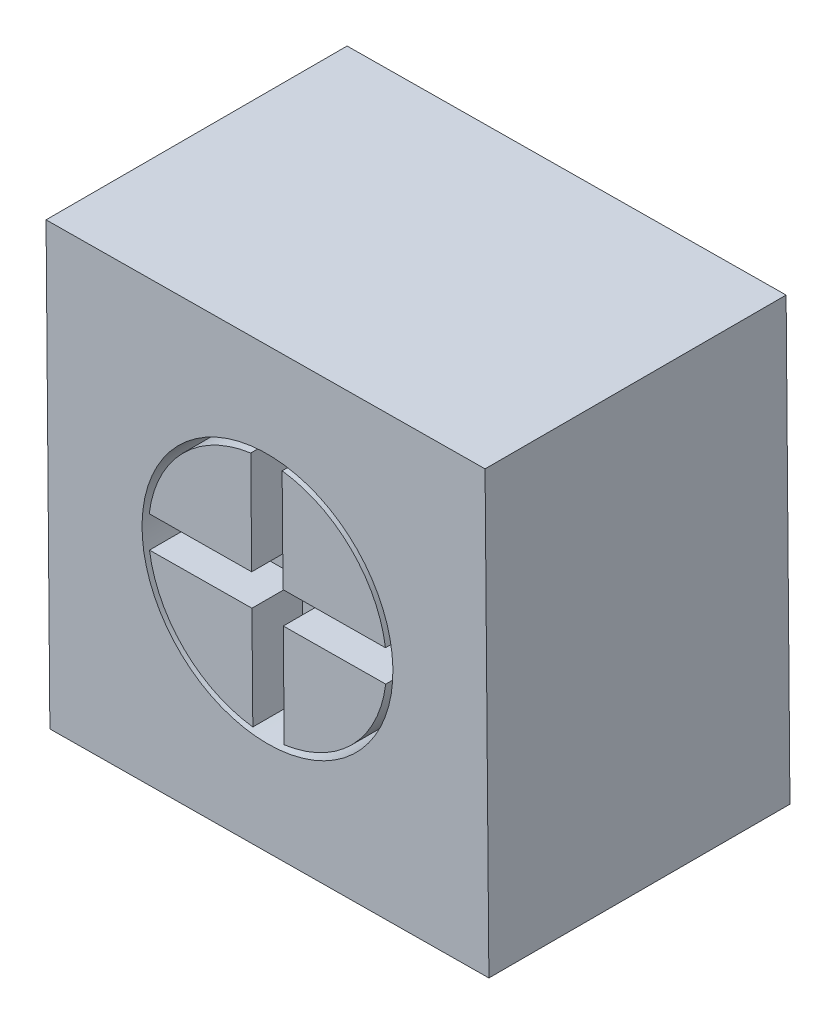
ISO-10303-21;
HEADER;
FILE_DESCRIPTION(('STEP AP214'),'2;1');
FILE_NAME('part.step','',(''),(''),'','','');
FILE_SCHEMA(('AUTOMOTIVE_DESIGN { 1 0 10303 214 1 1 1 1 }'));
ENDSEC;
DATA;
#1=APPLICATION_CONTEXT('core data for automotive mechanical design processes');
#2=APPLICATION_PROTOCOL_DEFINITION('international standard','automotive_design',2000,#1);
#3=PRODUCT_CONTEXT('',#1,'mechanical');
#4=PRODUCT('Part','Part','',(#3));
#5=PRODUCT_RELATED_PRODUCT_CATEGORY('part','',(#4));
#6=PRODUCT_DEFINITION_FORMATION('','',#4);
#7=PRODUCT_DEFINITION_CONTEXT('part definition',#1,'design');
#8=PRODUCT_DEFINITION('design','',#6,#7);
#9=PRODUCT_DEFINITION_SHAPE('','',#8);
#10=(LENGTH_UNIT() NAMED_UNIT(*) SI_UNIT(.MILLI.,.METRE.));
#11=(NAMED_UNIT(*) PLANE_ANGLE_UNIT() SI_UNIT($,.RADIAN.));
#12=(NAMED_UNIT(*) SI_UNIT($,.STERADIAN.) SOLID_ANGLE_UNIT());
#13=UNCERTAINTY_MEASURE_WITH_UNIT(LENGTH_MEASURE(1.E-05),#10,'distance_accuracy_value','');
#14=(GEOMETRIC_REPRESENTATION_CONTEXT(3) GLOBAL_UNCERTAINTY_ASSIGNED_CONTEXT((#13)) GLOBAL_UNIT_ASSIGNED_CONTEXT((#10,
#11,#12)) REPRESENTATION_CONTEXT('',''));
#15=CARTESIAN_POINT('',(0.,0.,0.));
#16=DIRECTION('',(0.,0.,1.));
#17=DIRECTION('',(1.,0.,0.));
#18=AXIS2_PLACEMENT_3D('',#15,#16,#17);
#19=CARTESIAN_POINT('',(11.8204337166092,8.08127161597988,10.5500249999999));
#20=DIRECTION('',(0.00872653549837708,-0.999961923064171,0.));
#21=DIRECTION('',(0.999961923064171,0.00872653549837708,0.));
#22=AXIS2_PLACEMENT_3D('',#19,#20,#21);
#23=PLANE('',#22);
#24=DIRECTION('',(-0.999961923064171,-0.0087265354983762,0.));
#25=VECTOR('',#24,1.);
#26=CARTESIAN_POINT('',(12.6371430277289,8.08839893016151,9.75002499999992));
#27=LINE('',#26,#25);
#28=CARTESIAN_POINT('',(12.6371430277289,8.08839893016151,9.75002499999992));
#29=VERTEX_POINT('',#28);
#30=CARTESIAN_POINT('',(11.0037244054895,8.07414430179826,9.75002499999992));
#31=VERTEX_POINT('',#30);
#32=EDGE_CURVE('P0_E97',#29,#31,#27,.T.);
#33=ORIENTED_EDGE('',*,*,#32,.F.);
#34=DIRECTION('',(0.,0.,1.));
#35=VECTOR('',#34,1.);
#36=CARTESIAN_POINT('',(12.6371430277289,8.08839893016151,10.5500249999999));
#37=LINE('',#36,#35);
#38=CARTESIAN_POINT('',(12.6371430277289,8.08839893016151,10.5500249999999));
#39=VERTEX_POINT('',#38);
#40=EDGE_CURVE('P0_E163',#39,#29,#37,.F.);
#41=ORIENTED_EDGE('',*,*,#40,.F.);
#42=DIRECTION('',(0.999961923064171,0.00872653549838258,0.));
#43=VECTOR('',#42,1.);
#44=CARTESIAN_POINT('',(11.0037244054895,8.07414430179825,10.5500249999999));
#45=LINE('',#44,#43);
#46=CARTESIAN_POINT('',(11.0037244054895,8.07414430179825,10.5500249999999));
#47=VERTEX_POINT('',#46);
#48=EDGE_CURVE('P0_E185',#47,#39,#45,.T.);
#49=ORIENTED_EDGE('',*,*,#48,.F.);
#50=DIRECTION('',(0.,0.,1.));
#51=VECTOR('',#50,1.);
#52=CARTESIAN_POINT('',(11.0037244054895,8.07414430179825,10.5500249999999));
#53=LINE('',#52,#51);
#54=EDGE_CURVE('P0_E166',#47,#31,#53,.F.);
#55=ORIENTED_EDGE('',*,*,#54,.T.);
#56=EDGE_LOOP('',(#33,#41,#49,#55));
#57=FACE_BOUND('',#56,.T.);
#58=ADVANCED_FACE('P0_F17',(#57),#23,.T.);
#59=CARTESIAN_POINT('',(12.6300157135473,8.90510824128119,10.5500249999999));
#60=DIRECTION('',(0.999961923064171,0.00872653549837334,0.));
#61=DIRECTION('',(-0.00872653549837334,0.999961923064171,0.));
#62=AXIS2_PLACEMENT_3D('',#59,#60,#61);
#63=PLANE('',#62);
#64=DIRECTION('',(0.00872653549834558,-0.999961923064172,0.));
#65=VECTOR('',#64,1.);
#66=CARTESIAN_POINT('',(12.6228883993657,9.72181755240088,9.75002499999993));
#67=LINE('',#66,#65);
#68=CARTESIAN_POINT('',(12.6228883993657,9.72181755240088,9.75002499999993));
#69=VERTEX_POINT('',#68);
#70=EDGE_CURVE('P0_E135',#69,#29,#67,.T.);
#71=ORIENTED_EDGE('',*,*,#70,.F.);
#72=DIRECTION('',(0.,0.,1.));
#73=VECTOR('',#72,1.);
#74=CARTESIAN_POINT('',(12.6228883993657,9.72181755240088,10.5500249999999));
#75=LINE('',#74,#73);
#76=CARTESIAN_POINT('',(12.6228883993657,9.72181755240088,10.5500249999999));
#77=VERTEX_POINT('',#76);
#78=EDGE_CURVE('P0_E161',#69,#77,#75,.T.);
#79=ORIENTED_EDGE('',*,*,#78,.T.);
#80=DIRECTION('',(-0.00872653549834558,0.999961923064172,0.));
#81=VECTOR('',#80,1.);
#82=CARTESIAN_POINT('',(12.6371430277289,8.08839893016151,10.5500249999999));
#83=LINE('',#82,#81);
#84=EDGE_CURVE('P0_E217',#39,#77,#83,.T.);
#85=ORIENTED_EDGE('',*,*,#84,.F.);
#86=ORIENTED_EDGE('',*,*,#40,.T.);
#87=EDGE_LOOP('',(#71,#79,#85,#86));
#88=FACE_BOUND('',#87,.T.);
#89=ADVANCED_FACE('P0_F233',(#88),#63,.T.);
#90=CARTESIAN_POINT('',(13.9538333003807,8.09988951209232,10.5500249999999));
#91=DIRECTION('',(0.00872653549837708,-0.999961923064171,0.));
#92=DIRECTION('',(0.999961923064171,0.00872653549837708,0.));
#93=AXIS2_PLACEMENT_3D('',#90,#91,#92);
#94=PLANE('',#93);
#95=DIRECTION('',(-0.999961923064171,-0.0087265354983762,0.));
#96=VECTOR('',#95,1.);
#97=CARTESIAN_POINT('',(14.7705426115004,8.10701682627395,9.75002499999992));
#98=LINE('',#97,#96);
#99=CARTESIAN_POINT('',(14.7705426115004,8.10701682627395,9.75002499999992));
#100=VERTEX_POINT('',#99);
#101=CARTESIAN_POINT('',(13.137123989261,8.0927621979107,9.75002499999993));
#102=VERTEX_POINT('',#101);
#103=EDGE_CURVE('P0_E126',#100,#102,#98,.T.);
#104=ORIENTED_EDGE('',*,*,#103,.F.);
#105=DIRECTION('',(0.,0.,1.));
#106=VECTOR('',#105,1.);
#107=CARTESIAN_POINT('',(14.7705426115004,8.10701682627395,10.5500249999999));
#108=LINE('',#107,#106);
#109=CARTESIAN_POINT('',(14.7705426115004,8.10701682627395,10.5500249999999));
#110=VERTEX_POINT('',#109);
#111=EDGE_CURVE('P0_E155',#100,#110,#108,.T.);
#112=ORIENTED_EDGE('',*,*,#111,.T.);
#113=DIRECTION('',(0.999961923064171,0.00872653549838258,0.));
#114=VECTOR('',#113,1.);
#115=CARTESIAN_POINT('',(13.137123989261,8.09276219791069,10.5500249999999));
#116=LINE('',#115,#114);
#117=CARTESIAN_POINT('',(13.137123989261,8.09276219791069,10.5500249999999));
#118=VERTEX_POINT('',#117);
#119=EDGE_CURVE('P0_E212',#118,#110,#116,.T.);
#120=ORIENTED_EDGE('',*,*,#119,.F.);
#121=DIRECTION('',(0.,0.,1.));
#122=VECTOR('',#121,1.);
#123=CARTESIAN_POINT('',(13.137123989261,8.0927621979107,10.5500249999999));
#124=LINE('',#123,#122);
#125=EDGE_CURVE('P0_E139',#102,#118,#124,.T.);
#126=ORIENTED_EDGE('',*,*,#125,.F.);
#127=EDGE_LOOP('',(#104,#112,#120,#126));
#128=FACE_BOUND('',#127,.T.);
#129=ADVANCED_FACE('P0_F276',(#128),#94,.T.);
#130=CARTESIAN_POINT('',(13.1299966750794,8.90947150903038,10.5500249999999));
#131=DIRECTION('',(-0.999961923064171,-0.00872653549837334,0.));
#132=DIRECTION('',(0.00872653549837334,-0.999961923064171,0.));
#133=AXIS2_PLACEMENT_3D('',#130,#131,#132);
#134=PLANE('',#133);
#135=DIRECTION('',(-0.00872653549834557,0.999961923064171,0.));
#136=VECTOR('',#135,1.);
#137=CARTESIAN_POINT('',(13.137123989261,8.0927621979107,9.75002499999992));
#138=LINE('',#137,#136);
#139=CARTESIAN_POINT('',(13.1228693608978,9.72618082015007,9.75002499999993));
#140=VERTEX_POINT('',#139);
#141=EDGE_CURVE('P0_E123',#102,#140,#138,.T.);
#142=ORIENTED_EDGE('',*,*,#141,.F.);
#143=ORIENTED_EDGE('',*,*,#125,.T.);
#144=DIRECTION('',(0.00872653549834551,-0.999961923064172,0.));
#145=VECTOR('',#144,1.);
#146=CARTESIAN_POINT('',(13.1228693608978,9.72618082015007,10.5500249999999));
#147=LINE('',#146,#145);
#148=CARTESIAN_POINT('',(13.1228693608978,9.72618082015007,10.5500249999999));
#149=VERTEX_POINT('',#148);
#150=EDGE_CURVE('P0_E209',#149,#118,#147,.T.);
#151=ORIENTED_EDGE('',*,*,#150,.F.);
#152=DIRECTION('',(0.,0.,1.));
#153=VECTOR('',#152,1.);
#154=CARTESIAN_POINT('',(13.1228693608978,9.72618082015007,10.5500249999999));
#155=LINE('',#154,#153);
#156=EDGE_CURVE('P0_E153',#149,#140,#155,.F.);
#157=ORIENTED_EDGE('',*,*,#156,.T.);
#158=EDGE_LOOP('',(#142,#143,#151,#157));
#159=FACE_BOUND('',#158,.T.);
#160=ADVANCED_FACE('P0_F239',(#159),#134,.T.);
#161=CARTESIAN_POINT('',(16.4197247473385,4.37126622678977,9.75002499999991));
#162=DIRECTION('',(0.,0.,1.));
#163=DIRECTION('',(0.,-1.,0.));
#164=AXIS2_PLACEMENT_3D('',#161,#162,#163);
#165=PLANE('',#164);
#166=ORIENTED_EDGE('',*,*,#141,.T.);
#167=CARTESIAN_POINT('',(12.8893151423696,7.84059008327006,9.75002499999992));
#168=DIRECTION('',(0.,0.,-1.));
#169=DIRECTION('',(0.,1.,0.));
#170=AXIS2_PLACEMENT_3D('',#167,#168,#169);
#171=CIRCLE('',#170,1.9);
#172=EDGE_CURVE('P0_E125',#140,#69,#171,.F.);
#173=ORIENTED_EDGE('',*,*,#172,.T.);
#174=ORIENTED_EDGE('',*,*,#70,.T.);
#175=ORIENTED_EDGE('',*,*,#32,.T.);
#176=CARTESIAN_POINT('',(12.8893151423696,7.84059008327006,9.75002499999992));
#177=DIRECTION('',(0.,0.,-1.));
#178=DIRECTION('',(0.,1.,0.));
#179=AXIS2_PLACEMENT_3D('',#176,#177,#178);
#180=CIRCLE('',#179,1.9);
#181=CARTESIAN_POINT('',(11.0080876732387,7.57416334026618,9.75002499999992));
#182=VERTEX_POINT('',#181);
#183=EDGE_CURVE('P0_E20',#31,#182,#180,.F.);
#184=ORIENTED_EDGE('',*,*,#183,.T.);
#185=DIRECTION('',(-0.999961923064171,-0.00872653549837708,0.));
#186=VECTOR('',#185,1.);
#187=CARTESIAN_POINT('',(11.8247969843584,7.5812906544478,9.75002499999992));
#188=LINE('',#187,#186);
#189=CARTESIAN_POINT('',(12.6415062954781,7.58841796862943,9.75002499999992));
#190=VERTEX_POINT('',#189);
#191=EDGE_CURVE('P0_E93',#190,#182,#188,.T.);
#192=ORIENTED_EDGE('',*,*,#191,.F.);
#193=DIRECTION('',(-0.00872653549837334,0.999961923064171,0.));
#194=VECTOR('',#193,1.);
#195=CARTESIAN_POINT('',(12.6486336096597,6.77170865750974,9.75002499999992));
#196=LINE('',#195,#194);
#197=CARTESIAN_POINT('',(12.6557609238413,5.95499934639006,9.75002499999992));
#198=VERTEX_POINT('',#197);
#199=EDGE_CURVE('P0_E119',#198,#190,#196,.T.);
#200=ORIENTED_EDGE('',*,*,#199,.F.);
#201=CARTESIAN_POINT('',(12.8893151423696,7.84059008327006,9.75002499999993));
#202=DIRECTION('',(0.,0.,-1.));
#203=DIRECTION('',(0.,1.,0.));
#204=AXIS2_PLACEMENT_3D('',#201,#202,#203);
#205=CIRCLE('',#204,1.9);
#206=CARTESIAN_POINT('',(13.1557418853734,5.95936261413924,9.75002499999992));
#207=VERTEX_POINT('',#206);
#208=EDGE_CURVE('P0_E100',#198,#207,#205,.F.);
#209=ORIENTED_EDGE('',*,*,#208,.T.);
#210=DIRECTION('',(0.00872653549837334,-0.999961923064171,0.));
#211=VECTOR('',#210,1.);
#212=CARTESIAN_POINT('',(13.1486145711918,6.77607192525893,9.75002499999992));
#213=LINE('',#212,#211);
#214=CARTESIAN_POINT('',(13.1414872570102,7.59278123637861,9.75002499999992));
#215=VERTEX_POINT('',#214);
#216=EDGE_CURVE('P0_E111',#215,#207,#213,.T.);
#217=ORIENTED_EDGE('',*,*,#216,.F.);
#218=DIRECTION('',(-0.999961923064171,-0.00872653549837708,0.));
#219=VECTOR('',#218,1.);
#220=CARTESIAN_POINT('',(13.9581965681299,7.59990855056024,9.75002499999992));
#221=LINE('',#220,#219);
#222=CARTESIAN_POINT('',(14.7749058792496,7.60703586474187,9.75002499999992));
#223=VERTEX_POINT('',#222);
#224=EDGE_CURVE('P0_E147',#223,#215,#221,.T.);
#225=ORIENTED_EDGE('',*,*,#224,.F.);
#226=CARTESIAN_POINT('',(12.8893151423696,7.84059008327006,9.75002499999992));
#227=DIRECTION('',(0.,0.,-1.));
#228=DIRECTION('',(0.,1.,0.));
#229=AXIS2_PLACEMENT_3D('',#226,#227,#228);
#230=CIRCLE('',#229,1.9);
#231=EDGE_CURVE('P0_E131',#223,#100,#230,.F.);
#232=ORIENTED_EDGE('',*,*,#231,.T.);
#233=ORIENTED_EDGE('',*,*,#103,.T.);
#234=EDGE_LOOP('',(#166,#173,#174,#175,#184,#192,#200,#209,#217,#225,#232,#233));
#235=FACE_BOUND('',#234,.T.);
#236=ADVANCED_FACE('P0_F91',(#235),#165,.T.);
#237=CARTESIAN_POINT('',(16.4197247473385,4.37126622678977,10.5500249999999));
#238=DIRECTION('',(0.,0.,1.));
#239=DIRECTION('',(0.,-1.,0.));
#240=AXIS2_PLACEMENT_3D('',#237,#238,#239);
#241=PLANE('',#240);
#242=ORIENTED_EDGE('',*,*,#84,.T.);
#243=CARTESIAN_POINT('',(12.8893151423696,7.84059008327006,10.5500249999999));
#244=DIRECTION('',(0.,0.,-1.));
#245=DIRECTION('',(0.,1.,0.));
#246=AXIS2_PLACEMENT_3D('',#243,#244,#245);
#247=CIRCLE('',#246,1.9);
#248=EDGE_CURVE('P0_E180',#47,#77,#247,.T.);
#249=ORIENTED_EDGE('',*,*,#248,.F.);
#250=ORIENTED_EDGE('',*,*,#48,.T.);
#251=EDGE_LOOP('',(#242,#249,#250));
#252=FACE_BOUND('',#251,.T.);
#253=ADVANCED_FACE('P0_F227',(#252),#241,.T.);
#254=CARTESIAN_POINT('',(16.4197247473385,4.37126622678977,10.5500249999999));
#255=DIRECTION('',(0.,0.,1.));
#256=DIRECTION('',(0.,-1.,0.));
#257=AXIS2_PLACEMENT_3D('',#254,#255,#256);
#258=PLANE('',#257);
#259=CARTESIAN_POINT('',(12.8893151423696,7.84059008327006,10.5500249999999));
#260=DIRECTION('',(0.,0.,-1.));
#261=DIRECTION('',(0.,1.,0.));
#262=AXIS2_PLACEMENT_3D('',#259,#260,#261);
#263=CIRCLE('',#262,1.9);
#264=EDGE_CURVE('P0_E176',#149,#110,#263,.T.);
#265=ORIENTED_EDGE('',*,*,#264,.F.);
#266=ORIENTED_EDGE('',*,*,#150,.T.);
#267=ORIENTED_EDGE('',*,*,#119,.T.);
#268=EDGE_LOOP('',(#265,#266,#267));
#269=FACE_BOUND('',#268,.T.);
#270=ADVANCED_FACE('P0_F307',(#269),#258,.T.);
#271=CARTESIAN_POINT('',(13.9581965681299,7.59990855056024,10.5500249999999));
#272=DIRECTION('',(-0.00872653549837708,0.999961923064171,0.));
#273=DIRECTION('',(-0.999961923064171,-0.00872653549837708,0.));
#274=AXIS2_PLACEMENT_3D('',#271,#272,#273);
#275=PLANE('',#274);
#276=ORIENTED_EDGE('',*,*,#224,.T.);
#277=DIRECTION('',(0.,0.,1.));
#278=VECTOR('',#277,1.);
#279=CARTESIAN_POINT('',(13.1414872570102,7.59278123637861,10.5500249999999));
#280=LINE('',#279,#278);
#281=CARTESIAN_POINT('',(13.1414872570102,7.59278123637861,10.5500249999999));
#282=VERTEX_POINT('',#281);
#283=EDGE_CURVE('P0_E144',#282,#215,#280,.F.);
#284=ORIENTED_EDGE('',*,*,#283,.F.);
#285=DIRECTION('',(-0.999961923064171,-0.0087265354983762,0.));
#286=VECTOR('',#285,1.);
#287=CARTESIAN_POINT('',(14.7749058792496,7.60703586474186,10.5500249999999));
#288=LINE('',#287,#286);
#289=CARTESIAN_POINT('',(14.7749058792496,7.60703586474186,10.5500249999999));
#290=VERTEX_POINT('',#289);
#291=EDGE_CURVE('P0_E179',#290,#282,#288,.T.);
#292=ORIENTED_EDGE('',*,*,#291,.F.);
#293=DIRECTION('',(0.,0.,1.));
#294=VECTOR('',#293,1.);
#295=CARTESIAN_POINT('',(14.7749058792496,7.60703586474187,10.5500249999999));
#296=LINE('',#295,#294);
#297=EDGE_CURVE('P0_E150',#290,#223,#296,.F.);
#298=ORIENTED_EDGE('',*,*,#297,.T.);
#299=EDGE_LOOP('',(#276,#284,#292,#298));
#300=FACE_BOUND('',#299,.T.);
#301=ADVANCED_FACE('P0_F274',(#300),#275,.T.);
#302=CARTESIAN_POINT('',(13.1486145711918,6.77607192525893,10.5500249999999));
#303=DIRECTION('',(-0.999961923064171,-0.00872653549837334,0.));
#304=DIRECTION('',(0.00872653549837334,-0.999961923064171,0.));
#305=AXIS2_PLACEMENT_3D('',#302,#303,#304);
#306=PLANE('',#305);
#307=ORIENTED_EDGE('',*,*,#216,.T.);
#308=DIRECTION('',(0.,0.,1.));
#309=VECTOR('',#308,1.);
#310=CARTESIAN_POINT('',(13.1557418853734,5.95936261413924,10.5500249999999));
#311=LINE('',#310,#309);
#312=CARTESIAN_POINT('',(13.1557418853734,5.95936261413924,10.5500249999999));
#313=VERTEX_POINT('',#312);
#314=EDGE_CURVE('P0_E109',#207,#313,#311,.T.);
#315=ORIENTED_EDGE('',*,*,#314,.T.);
#316=DIRECTION('',(0.00872653549834557,-0.999961923064171,0.));
#317=VECTOR('',#316,1.);
#318=CARTESIAN_POINT('',(13.1414872570102,7.59278123637861,10.5500249999999));
#319=LINE('',#318,#317);
#320=EDGE_CURVE('P0_E198',#282,#313,#319,.T.);
#321=ORIENTED_EDGE('',*,*,#320,.F.);
#322=ORIENTED_EDGE('',*,*,#283,.T.);
#323=EDGE_LOOP('',(#307,#315,#321,#322));
#324=FACE_BOUND('',#323,.T.);
#325=ADVANCED_FACE('P0_F196',(#324),#306,.T.);
#326=CARTESIAN_POINT('',(11.8247969843584,7.5812906544478,10.5500249999999));
#327=DIRECTION('',(-0.00872653549837708,0.999961923064171,0.));
#328=DIRECTION('',(-0.999961923064171,-0.00872653549837708,0.));
#329=AXIS2_PLACEMENT_3D('',#326,#327,#328);
#330=PLANE('',#329);
#331=ORIENTED_EDGE('',*,*,#191,.T.);
#332=DIRECTION('',(0.,0.,1.));
#333=VECTOR('',#332,1.);
#334=CARTESIAN_POINT('',(11.0080876732387,7.57416334026617,10.5500249999999));
#335=LINE('',#334,#333);
#336=CARTESIAN_POINT('',(11.0080876732387,7.57416334026617,10.5500249999999));
#337=VERTEX_POINT('',#336);
#338=EDGE_CURVE('P0_E35',#182,#337,#335,.T.);
#339=ORIENTED_EDGE('',*,*,#338,.T.);
#340=DIRECTION('',(-0.999961923064171,-0.00872653549837567,0.));
#341=VECTOR('',#340,1.);
#342=CARTESIAN_POINT('',(12.6415062954781,7.58841796862942,10.5500249999999));
#343=LINE('',#342,#341);
#344=CARTESIAN_POINT('',(12.6415062954781,7.58841796862942,10.5500249999999));
#345=VERTEX_POINT('',#344);
#346=EDGE_CURVE('P0_E249',#345,#337,#343,.T.);
#347=ORIENTED_EDGE('',*,*,#346,.F.);
#348=DIRECTION('',(0.,0.,1.));
#349=VECTOR('',#348,1.);
#350=CARTESIAN_POINT('',(12.6415062954781,7.58841796862943,10.5500249999999));
#351=LINE('',#350,#349);
#352=EDGE_CURVE('P0_E107',#190,#345,#351,.T.);
#353=ORIENTED_EDGE('',*,*,#352,.F.);
#354=EDGE_LOOP('',(#331,#339,#347,#353));
#355=FACE_BOUND('',#354,.T.);
#356=ADVANCED_FACE('P0_F105',(#355),#330,.T.);
#357=CARTESIAN_POINT('',(12.6486336096597,6.77170865750974,10.5500249999999));
#358=DIRECTION('',(0.999961923064171,0.00872653549837334,0.));
#359=DIRECTION('',(-0.00872653549837334,0.999961923064171,0.));
#360=AXIS2_PLACEMENT_3D('',#357,#358,#359);
#361=PLANE('',#360);
#362=ORIENTED_EDGE('',*,*,#199,.T.);
#363=ORIENTED_EDGE('',*,*,#352,.T.);
#364=DIRECTION('',(-0.0087265354984061,0.999961923064171,0.));
#365=VECTOR('',#364,1.);
#366=CARTESIAN_POINT('',(12.6557609238414,5.95499934639005,10.5500249999999));
#367=LINE('',#366,#365);
#368=CARTESIAN_POINT('',(12.6557609238414,5.95499934639005,10.5500249999999));
#369=VERTEX_POINT('',#368);
#370=EDGE_CURVE('P0_E175',#369,#345,#367,.T.);
#371=ORIENTED_EDGE('',*,*,#370,.F.);
#372=DIRECTION('',(0.,0.,1.));
#373=VECTOR('',#372,1.);
#374=CARTESIAN_POINT('',(12.6557609238413,5.95499934639005,10.5500249999999));
#375=LINE('',#374,#373);
#376=EDGE_CURVE('P0_E103',#369,#198,#375,.F.);
#377=ORIENTED_EDGE('',*,*,#376,.T.);
#378=EDGE_LOOP('',(#362,#363,#371,#377));
#379=FACE_BOUND('',#378,.T.);
#380=ADVANCED_FACE('P0_F255',(#379),#361,.T.);
#381=CARTESIAN_POINT('',(16.4197247473385,4.37126622678978,7.15002499999991));
#382=DIRECTION('',(0.,0.,1.));
#383=DIRECTION('',(0.,-1.,0.));
#384=AXIS2_PLACEMENT_3D('',#381,#382,#383);
#385=PLANE('',#384);
#386=CARTESIAN_POINT('',(12.8893151423696,7.84059008327007,7.15002499999992));
#387=DIRECTION('',(0.,0.,-1.));
#388=DIRECTION('',(0.,1.,0.));
#389=AXIS2_PLACEMENT_3D('',#386,#387,#388);
#390=CIRCLE('',#389,1.9);
#391=CARTESIAN_POINT('',(12.8893151423696,9.74059008327007,7.15002499999993));
#392=VERTEX_POINT('',#391);
#393=EDGE_CURVE('P0_E172',#392,#392,#390,.F.);
#394=ORIENTED_EDGE('',*,*,#393,.F.);
#395=EDGE_LOOP('',(#394));
#396=FACE_BOUND('',#395,.T.);
#397=ADVANCED_FACE('P0_F295',(#396),#385,.F.);
#398=CARTESIAN_POINT('',(16.4197247473385,4.37126622678977,10.5500249999999));
#399=DIRECTION('',(0.,0.,1.));
#400=DIRECTION('',(0.,-1.,0.));
#401=AXIS2_PLACEMENT_3D('',#398,#399,#400);
#402=PLANE('',#401);
#403=ORIENTED_EDGE('',*,*,#320,.T.);
#404=CARTESIAN_POINT('',(12.8893151423696,7.84059008327006,10.5500249999999));
#405=DIRECTION('',(0.,0.,-1.));
#406=DIRECTION('',(0.,1.,0.));
#407=AXIS2_PLACEMENT_3D('',#404,#405,#406);
#408=CIRCLE('',#407,1.9);
#409=EDGE_CURVE('P0_E26',#290,#313,#408,.T.);
#410=ORIENTED_EDGE('',*,*,#409,.F.);
#411=ORIENTED_EDGE('',*,*,#291,.T.);
#412=EDGE_LOOP('',(#403,#410,#411));
#413=FACE_BOUND('',#412,.T.);
#414=ADVANCED_FACE('P0_F273',(#413),#402,.T.);
#415=CARTESIAN_POINT('',(16.4197247473385,4.37126622678977,10.5500249999999));
#416=DIRECTION('',(0.,0.,1.));
#417=DIRECTION('',(0.,-1.,0.));
#418=AXIS2_PLACEMENT_3D('',#415,#416,#417);
#419=PLANE('',#418);
#420=CARTESIAN_POINT('',(12.8893151423696,7.84059008327006,10.5500249999999));
#421=DIRECTION('',(0.,0.,-1.));
#422=DIRECTION('',(0.,1.,0.));
#423=AXIS2_PLACEMENT_3D('',#420,#421,#422);
#424=CIRCLE('',#423,1.9);
#425=EDGE_CURVE('P0_E11',#369,#337,#424,.T.);
#426=ORIENTED_EDGE('',*,*,#425,.F.);
#427=ORIENTED_EDGE('',*,*,#370,.T.);
#428=ORIENTED_EDGE('',*,*,#346,.T.);
#429=EDGE_LOOP('',(#426,#427,#428));
#430=FACE_BOUND('',#429,.T.);
#431=ADVANCED_FACE('P0_F257',(#430),#419,.T.);
#432=CARTESIAN_POINT('',(12.8893151423696,7.84059008327006,10.5500249999999));
#433=DIRECTION('',(0.,0.,-1.));
#434=DIRECTION('',(0.,1.,0.));
#435=AXIS2_PLACEMENT_3D('',#432,#433,#434);
#436=CYLINDRICAL_SURFACE('',#435,1.9);
#437=ORIENTED_EDGE('',*,*,#393,.T.);
#438=EDGE_LOOP('',(#437));
#439=FACE_BOUND('',#438,.T.);
#440=ORIENTED_EDGE('',*,*,#338,.F.);
#441=ORIENTED_EDGE('',*,*,#183,.F.);
#442=ORIENTED_EDGE('',*,*,#54,.F.);
#443=ORIENTED_EDGE('',*,*,#248,.T.);
#444=ORIENTED_EDGE('',*,*,#78,.F.);
#445=ORIENTED_EDGE('',*,*,#172,.F.);
#446=ORIENTED_EDGE('',*,*,#156,.F.);
#447=ORIENTED_EDGE('',*,*,#264,.T.);
#448=ORIENTED_EDGE('',*,*,#111,.F.);
#449=ORIENTED_EDGE('',*,*,#231,.F.);
#450=ORIENTED_EDGE('',*,*,#297,.F.);
#451=ORIENTED_EDGE('',*,*,#409,.T.);
#452=ORIENTED_EDGE('',*,*,#314,.F.);
#453=ORIENTED_EDGE('',*,*,#208,.F.);
#454=ORIENTED_EDGE('',*,*,#376,.F.);
#455=ORIENTED_EDGE('',*,*,#425,.T.);
#456=EDGE_LOOP('',(#440,#441,#442,#443,#444,#445,#446,#447,#448,#449,#450,#451,#452,#453,#454,#455));
#457=FACE_BOUND('',#456,.T.);
#458=ADVANCED_FACE('P0_F101',(#439,#457),#436,.T.);
#459=CLOSED_SHELL('',(#58,#89,#129,#160,#236,#253,#270,#301,#325,#356,#380,#397,#414,#431,#458));
#460=MANIFOLD_SOLID_BREP('P0_B1',#459);
#461=CARTESIAN_POINT('',(16.4197247473385,4.37126622678978,7.05002499999991));
#462=DIRECTION('',(0.,0.,1.));
#463=DIRECTION('',(0.,-1.,0.));
#464=AXIS2_PLACEMENT_3D('',#461,#462,#463);
#465=PLANE('',#464);
#466=CARTESIAN_POINT('',(12.8893151423696,7.84059008327007,7.05002499999992));
#467=DIRECTION('',(0.,0.,1.));
#468=DIRECTION('',(0.,-1.,0.));
#469=AXIS2_PLACEMENT_3D('',#466,#467,#468);
#470=CIRCLE('',#469,2.);
#471=CARTESIAN_POINT('',(12.8893151423696,5.84059008327007,7.05002499999991));
#472=VERTEX_POINT('',#471);
#473=EDGE_CURVE('P1_E20',#472,#472,#470,.T.);
#474=ORIENTED_EDGE('',*,*,#473,.T.);
#475=EDGE_LOOP('',(#474));
#476=FACE_BOUND('',#475,.T.);
#477=ADVANCED_FACE('P1_F17',(#476),#465,.T.);
#478=CARTESIAN_POINT('',(12.8893151423696,7.84059008327006,10.5500249999999));
#479=DIRECTION('',(0.,0.,1.));
#480=DIRECTION('',(0.,-1.,0.));
#481=AXIS2_PLACEMENT_3D('',#478,#479,#480);
#482=CYLINDRICAL_SURFACE('',#481,2.);
#483=CARTESIAN_POINT('',(12.8893151423696,7.84059008327006,10.5500249999999));
#484=DIRECTION('',(0.,0.,1.));
#485=DIRECTION('',(0.,-1.,0.));
#486=AXIS2_PLACEMENT_3D('',#483,#484,#485);
#487=CIRCLE('',#486,2.);
#488=CARTESIAN_POINT('',(12.8893151423696,5.84059008327006,10.5500249999999));
#489=VERTEX_POINT('',#488);
#490=EDGE_CURVE('P1_E76',#489,#489,#487,.F.);
#491=ORIENTED_EDGE('',*,*,#490,.F.);
#492=EDGE_LOOP('',(#491));
#493=FACE_BOUND('',#492,.T.);
#494=ORIENTED_EDGE('',*,*,#473,.F.);
#495=EDGE_LOOP('',(#494));
#496=FACE_BOUND('',#495,.T.);
#497=ADVANCED_FACE('P1_F90',(#493,#496),#482,.F.);
#498=CARTESIAN_POINT('',(16.4197247473385,4.37126622678977,10.5500249999999));
#499=DIRECTION('',(0.,0.,1.));
#500=DIRECTION('',(0.,-1.,0.));
#501=AXIS2_PLACEMENT_3D('',#498,#499,#500);
#502=PLANE('',#501);
#503=DIRECTION('',(0.999961923064171,0.00872653549837334,0.));
#504=VECTOR('',#503,1.);
#505=CARTESIAN_POINT('',(12.9198580166139,4.34072335254546,10.5500249999999));
#506=LINE('',#505,#504);
#507=CARTESIAN_POINT('',(16.4197247473385,4.37126622678977,10.5500249999999));
#508=VERTEX_POINT('',#507);
#509=CARTESIAN_POINT('',(9.41999128588926,4.31018047830116,10.5500249999999));
#510=VERTEX_POINT('',#509);
#511=EDGE_CURVE('P1_E67',#508,#510,#506,.F.);
#512=ORIENTED_EDGE('',*,*,#511,.F.);
#513=DIRECTION('',(-0.00872653549837334,0.999961923064171,0.));
#514=VECTOR('',#513,1.);
#515=CARTESIAN_POINT('',(16.3891818730942,7.87113295751438,10.5500249999999));
#516=LINE('',#515,#514);
#517=CARTESIAN_POINT('',(16.3586389988498,11.370999688239,10.5500249999999));
#518=VERTEX_POINT('',#517);
#519=EDGE_CURVE('P1_E58',#518,#508,#516,.F.);
#520=ORIENTED_EDGE('',*,*,#519,.F.);
#521=DIRECTION('',(-0.999961923064171,-0.00872653549837334,0.));
#522=VECTOR('',#521,1.);
#523=CARTESIAN_POINT('',(12.8587722681252,11.3404568139947,10.5500249999999));
#524=LINE('',#523,#522);
#525=CARTESIAN_POINT('',(9.35890553740065,11.3099139397504,10.5500249999999));
#526=VERTEX_POINT('',#525);
#527=EDGE_CURVE('P1_E53',#526,#518,#524,.F.);
#528=ORIENTED_EDGE('',*,*,#527,.F.);
#529=DIRECTION('',(0.00872653549837334,-0.999961923064171,0.));
#530=VECTOR('',#529,1.);
#531=CARTESIAN_POINT('',(9.38944841164496,7.81004720902577,10.5500249999999));
#532=LINE('',#531,#530);
#533=EDGE_CURVE('P1_E72',#510,#526,#532,.F.);
#534=ORIENTED_EDGE('',*,*,#533,.F.);
#535=EDGE_LOOP('',(#512,#520,#528,#534));
#536=FACE_BOUND('',#535,.T.);
#537=ORIENTED_EDGE('',*,*,#490,.T.);
#538=EDGE_LOOP('',(#537));
#539=FACE_BOUND('',#538,.T.);
#540=ADVANCED_FACE('P1_F70',(#536,#539),#502,.T.);
#541=CARTESIAN_POINT('',(12.9198580166139,4.34072335254548,5.75002499999991));
#542=DIRECTION('',(0.00872653549837334,-0.999961923064171,0.));
#543=DIRECTION('',(0.999961923064171,0.00872653549837334,0.));
#544=AXIS2_PLACEMENT_3D('',#541,#542,#543);
#545=PLANE('',#544);
#546=DIRECTION('',(0.999961923064171,0.00872653549837285,0.));
#547=VECTOR('',#546,1.);
#548=CARTESIAN_POINT('',(9.41999128588926,4.31018047830117,5.75002499999991));
#549=LINE('',#548,#547);
#550=CARTESIAN_POINT('',(9.41999128588926,4.31018047830117,5.75002499999992));
#551=VERTEX_POINT('',#550);
#552=CARTESIAN_POINT('',(16.4197247473385,4.37126622678978,5.75002499999991));
#553=VERTEX_POINT('',#552);
#554=EDGE_CURVE('P1_E80',#551,#553,#549,.T.);
#555=ORIENTED_EDGE('',*,*,#554,.T.);
#556=DIRECTION('',(0.,0.,1.));
#557=VECTOR('',#556,1.);
#558=CARTESIAN_POINT('',(16.4197247473385,4.37126622678977,5.75002499999992));
#559=LINE('',#558,#557);
#560=EDGE_CURVE('P1_E63',#508,#553,#559,.F.);
#561=ORIENTED_EDGE('',*,*,#560,.F.);
#562=ORIENTED_EDGE('',*,*,#511,.T.);
#563=DIRECTION('',(0.,0.,1.));
#564=VECTOR('',#563,1.);
#565=CARTESIAN_POINT('',(9.41999128588927,4.31018047830117,5.75002499999992));
#566=LINE('',#565,#564);
#567=EDGE_CURVE('P1_E173',#551,#510,#566,.T.);
#568=ORIENTED_EDGE('',*,*,#567,.F.);
#569=EDGE_LOOP('',(#555,#561,#562,#568));
#570=FACE_BOUND('',#569,.T.);
#571=ADVANCED_FACE('P1_F79',(#570),#545,.T.);
#572=CARTESIAN_POINT('',(16.3891818730942,7.87113295751438,5.75002499999992));
#573=DIRECTION('',(0.999961923064171,0.00872653549837334,0.));
#574=DIRECTION('',(-0.00872653549837334,0.999961923064171,0.));
#575=AXIS2_PLACEMENT_3D('',#572,#573,#574);
#576=PLANE('',#575);
#577=DIRECTION('',(-0.00872653549838576,0.999961923064171,0.));
#578=VECTOR('',#577,1.);
#579=CARTESIAN_POINT('',(16.4197247473385,4.37126622678978,5.75002499999991));
#580=LINE('',#579,#578);
#581=CARTESIAN_POINT('',(16.3586389988498,11.370999688239,5.75002499999992));
#582=VERTEX_POINT('',#581);
#583=EDGE_CURVE('P1_E168',#553,#582,#580,.T.);
#584=ORIENTED_EDGE('',*,*,#583,.T.);
#585=DIRECTION('',(0.,0.,1.));
#586=VECTOR('',#585,1.);
#587=CARTESIAN_POINT('',(16.3586389988498,11.370999688239,5.75002499999993));
#588=LINE('',#587,#586);
#589=EDGE_CURVE('P1_E65',#518,#582,#588,.F.);
#590=ORIENTED_EDGE('',*,*,#589,.F.);
#591=ORIENTED_EDGE('',*,*,#519,.T.);
#592=ORIENTED_EDGE('',*,*,#560,.T.);
#593=EDGE_LOOP('',(#584,#590,#591,#592));
#594=FACE_BOUND('',#593,.T.);
#595=ADVANCED_FACE('P1_F61',(#594),#576,.T.);
#596=CARTESIAN_POINT('',(12.8587722681252,11.3404568139947,5.75002499999993));
#597=DIRECTION('',(-0.00872653549837334,0.999961923064171,0.));
#598=DIRECTION('',(-0.999961923064171,-0.00872653549837334,0.));
#599=AXIS2_PLACEMENT_3D('',#596,#597,#598);
#600=PLANE('',#599);
#601=DIRECTION('',(-0.999961923064171,-0.00872653549837147,0.));
#602=VECTOR('',#601,1.);
#603=CARTESIAN_POINT('',(16.3586389988498,11.370999688239,5.75002499999994));
#604=LINE('',#603,#602);
#605=CARTESIAN_POINT('',(9.35890553740065,11.3099139397504,5.75002499999993));
#606=VERTEX_POINT('',#605);
#607=EDGE_CURVE('P1_E26',#582,#606,#604,.T.);
#608=ORIENTED_EDGE('',*,*,#607,.T.);
#609=DIRECTION('',(0.,0.,1.));
#610=VECTOR('',#609,1.);
#611=CARTESIAN_POINT('',(9.35890553740065,11.3099139397504,5.75002499999992));
#612=LINE('',#611,#610);
#613=EDGE_CURVE('P1_E34',#526,#606,#612,.F.);
#614=ORIENTED_EDGE('',*,*,#613,.F.);
#615=ORIENTED_EDGE('',*,*,#527,.T.);
#616=ORIENTED_EDGE('',*,*,#589,.T.);
#617=EDGE_LOOP('',(#608,#614,#615,#616));
#618=FACE_BOUND('',#617,.T.);
#619=ADVANCED_FACE('P1_F107',(#618),#600,.T.);
#620=CARTESIAN_POINT('',(9.38944841164496,7.81004720902577,5.75002499999992));
#621=DIRECTION('',(-0.999961923064171,-0.00872653549837334,0.));
#622=DIRECTION('',(0.00872653549837334,-0.999961923064171,0.));
#623=AXIS2_PLACEMENT_3D('',#620,#621,#622);
#624=PLANE('',#623);
#625=DIRECTION('',(0.00872653549837261,-0.999961923064171,0.));
#626=VECTOR('',#625,1.);
#627=CARTESIAN_POINT('',(9.35890553740065,11.3099139397504,5.75002499999994));
#628=LINE('',#627,#626);
#629=EDGE_CURVE('P1_E11',#606,#551,#628,.T.);
#630=ORIENTED_EDGE('',*,*,#629,.T.);
#631=ORIENTED_EDGE('',*,*,#567,.T.);
#632=ORIENTED_EDGE('',*,*,#533,.T.);
#633=ORIENTED_EDGE('',*,*,#613,.T.);
#634=EDGE_LOOP('',(#630,#631,#632,#633));
#635=FACE_BOUND('',#634,.T.);
#636=ADVANCED_FACE('P1_F101',(#635),#624,.T.);
#637=CARTESIAN_POINT('',(16.4197247473385,4.37126622678978,5.75002499999991));
#638=DIRECTION('',(0.,0.,1.));
#639=DIRECTION('',(0.,-1.,0.));
#640=AXIS2_PLACEMENT_3D('',#637,#638,#639);
#641=PLANE('',#640);
#642=ORIENTED_EDGE('',*,*,#607,.F.);
#643=ORIENTED_EDGE('',*,*,#583,.F.);
#644=ORIENTED_EDGE('',*,*,#554,.F.);
#645=ORIENTED_EDGE('',*,*,#629,.F.);
#646=EDGE_LOOP('',(#642,#643,#644,#645));
#647=FACE_BOUND('',#646,.T.);
#648=ADVANCED_FACE('P1_F99',(#647),#641,.F.);
#649=CLOSED_SHELL('',(#477,#497,#540,#571,#595,#619,#636,#648));
#650=MANIFOLD_SOLID_BREP('P1_B1',#649);
#651=ADVANCED_BREP_SHAPE_REPRESENTATION('',(#18,#460,#650),#14);
#652=SHAPE_DEFINITION_REPRESENTATION(#9,#651);
ENDSEC;
END-ISO-10303-21;
